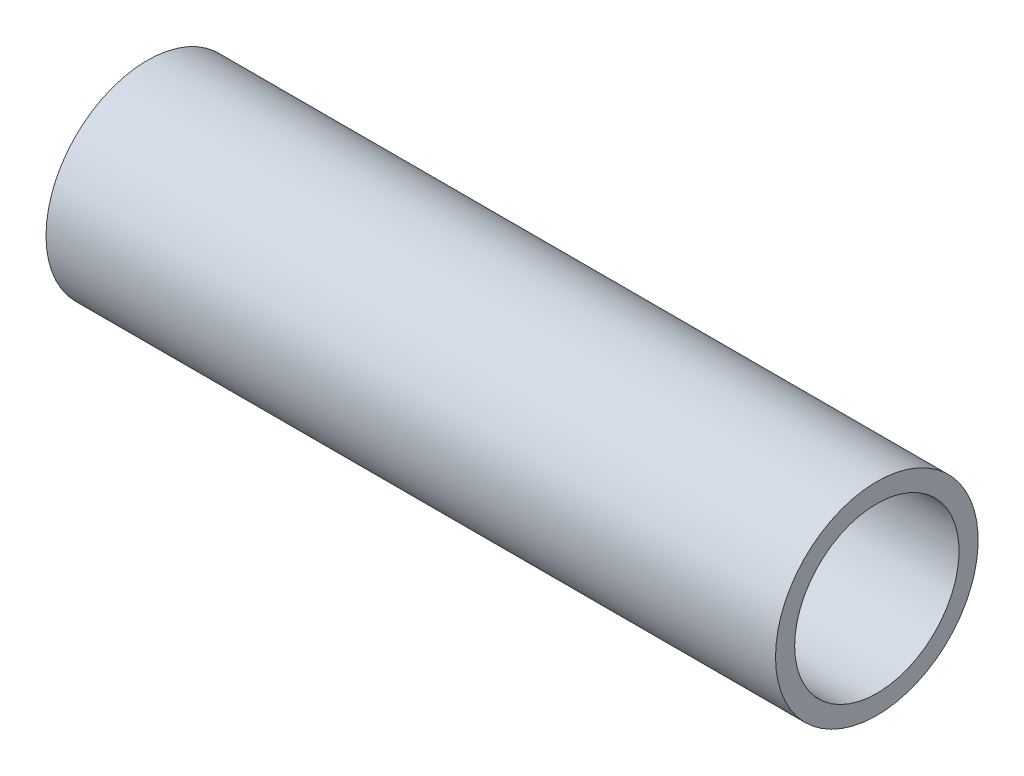
ISO-10303-21;
HEADER;
FILE_DESCRIPTION(('STEP AP214'),'2;1');
FILE_NAME('part.step','',(''),(''),'','','');
FILE_SCHEMA(('AUTOMOTIVE_DESIGN { 1 0 10303 214 1 1 1 1 }'));
ENDSEC;
DATA;
#1=APPLICATION_CONTEXT('core data for automotive mechanical design processes');
#2=APPLICATION_PROTOCOL_DEFINITION('international standard','automotive_design',2000,#1);
#3=PRODUCT_CONTEXT('',#1,'mechanical');
#4=PRODUCT('Part','Part','',(#3));
#5=PRODUCT_RELATED_PRODUCT_CATEGORY('part','',(#4));
#6=PRODUCT_DEFINITION_FORMATION('','',#4);
#7=PRODUCT_DEFINITION_CONTEXT('part definition',#1,'design');
#8=PRODUCT_DEFINITION('design','',#6,#7);
#9=PRODUCT_DEFINITION_SHAPE('','',#8);
#10=(LENGTH_UNIT() NAMED_UNIT(*) SI_UNIT(.MILLI.,.METRE.));
#11=(NAMED_UNIT(*) PLANE_ANGLE_UNIT() SI_UNIT($,.RADIAN.));
#12=(NAMED_UNIT(*) SI_UNIT($,.STERADIAN.) SOLID_ANGLE_UNIT());
#13=UNCERTAINTY_MEASURE_WITH_UNIT(LENGTH_MEASURE(1.E-05),#10,'distance_accuracy_value','');
#14=(GEOMETRIC_REPRESENTATION_CONTEXT(3) GLOBAL_UNCERTAINTY_ASSIGNED_CONTEXT((#13)) GLOBAL_UNIT_ASSIGNED_CONTEXT((#10,
#11,#12)) REPRESENTATION_CONTEXT('',''));
#15=CARTESIAN_POINT('',(0.,0.,0.));
#16=DIRECTION('',(0.,0.,1.));
#17=DIRECTION('',(1.,0.,0.));
#18=AXIS2_PLACEMENT_3D('',#15,#16,#17);
#19=CARTESIAN_POINT('',(28.575,0.,0.));
#20=DIRECTION('',(-1.,0.,0.));
#21=DIRECTION('',(0.,0.,1.));
#22=AXIS2_PLACEMENT_3D('',#19,#20,#21);
#23=CYLINDRICAL_SURFACE('',#22,6.4375);
#24=CARTESIAN_POINT('',(-28.575,0.,0.));
#25=DIRECTION('',(-1.,0.,0.));
#26=DIRECTION('',(0.,0.,1.));
#27=AXIS2_PLACEMENT_3D('',#24,#25,#26);
#28=CIRCLE('',#27,6.4375);
#29=CARTESIAN_POINT('',(-28.575,0.,6.4375));
#30=VERTEX_POINT('',#29);
#31=EDGE_CURVE('E38',#30,#30,#28,.T.);
#32=ORIENTED_EDGE('',*,*,#31,.T.);
#33=EDGE_LOOP('',(#32));
#34=FACE_BOUND('',#33,.T.);
#35=CARTESIAN_POINT('',(28.575,0.,0.));
#36=DIRECTION('',(-1.,0.,0.));
#37=DIRECTION('',(0.,0.,1.));
#38=AXIS2_PLACEMENT_3D('',#35,#36,#37);
#39=CIRCLE('',#38,6.4375);
#40=CARTESIAN_POINT('',(28.575,0.,6.4375));
#41=VERTEX_POINT('',#40);
#42=EDGE_CURVE('E25',#41,#41,#39,.T.);
#43=ORIENTED_EDGE('',*,*,#42,.F.);
#44=EDGE_LOOP('',(#43));
#45=FACE_BOUND('',#44,.T.);
#46=ADVANCED_FACE('F22',(#34,#45),#23,.F.);
#47=CARTESIAN_POINT('',(28.575,0.,0.));
#48=DIRECTION('',(1.,0.,0.));
#49=DIRECTION('',(0.,0.,-1.));
#50=AXIS2_PLACEMENT_3D('',#47,#48,#49);
#51=PLANE('',#50);
#52=ORIENTED_EDGE('',*,*,#42,.T.);
#53=EDGE_LOOP('',(#52));
#54=FACE_BOUND('',#53,.T.);
#55=CARTESIAN_POINT('',(28.575,0.,0.));
#56=DIRECTION('',(-1.,0.,0.));
#57=DIRECTION('',(0.,0.,1.));
#58=AXIS2_PLACEMENT_3D('',#55,#56,#57);
#59=CIRCLE('',#58,7.9375);
#60=CARTESIAN_POINT('',(28.575,0.,7.9375));
#61=VERTEX_POINT('',#60);
#62=EDGE_CURVE('E30',#61,#61,#59,.T.);
#63=ORIENTED_EDGE('',*,*,#62,.F.);
#64=EDGE_LOOP('',(#63));
#65=FACE_BOUND('',#64,.T.);
#66=ADVANCED_FACE('F47',(#54,#65),#51,.T.);
#67=CARTESIAN_POINT('',(-28.575,0.,0.));
#68=DIRECTION('',(1.,0.,0.));
#69=DIRECTION('',(0.,0.,-1.));
#70=AXIS2_PLACEMENT_3D('',#67,#68,#69);
#71=PLANE('',#70);
#72=ORIENTED_EDGE('',*,*,#31,.F.);
#73=EDGE_LOOP('',(#72));
#74=FACE_BOUND('',#73,.T.);
#75=CARTESIAN_POINT('',(-28.575,0.,0.));
#76=DIRECTION('',(-1.,0.,0.));
#77=DIRECTION('',(0.,0.,1.));
#78=AXIS2_PLACEMENT_3D('',#75,#76,#77);
#79=CIRCLE('',#78,7.9375);
#80=CARTESIAN_POINT('',(-28.575,0.,7.9375));
#81=VERTEX_POINT('',#80);
#82=EDGE_CURVE('E12',#81,#81,#79,.F.);
#83=ORIENTED_EDGE('',*,*,#82,.F.);
#84=EDGE_LOOP('',(#83));
#85=FACE_BOUND('',#84,.T.);
#86=ADVANCED_FACE('F56',(#74,#85),#71,.F.);
#87=CARTESIAN_POINT('',(28.575,0.,0.));
#88=DIRECTION('',(-1.,0.,0.));
#89=DIRECTION('',(0.,0.,1.));
#90=AXIS2_PLACEMENT_3D('',#87,#88,#89);
#91=CYLINDRICAL_SURFACE('',#90,7.9375);
#92=ORIENTED_EDGE('',*,*,#82,.T.);
#93=EDGE_LOOP('',(#92));
#94=FACE_BOUND('',#93,.T.);
#95=ORIENTED_EDGE('',*,*,#62,.T.);
#96=EDGE_LOOP('',(#95));
#97=FACE_BOUND('',#96,.T.);
#98=ADVANCED_FACE('F57',(#94,#97),#91,.T.);
#99=CLOSED_SHELL('',(#46,#66,#86,#98));
#100=MANIFOLD_SOLID_BREP('B1',#99);
#101=ADVANCED_BREP_SHAPE_REPRESENTATION('',(#18,#100),#14);
#102=SHAPE_DEFINITION_REPRESENTATION(#9,#101);
ENDSEC;
END-ISO-10303-21;
